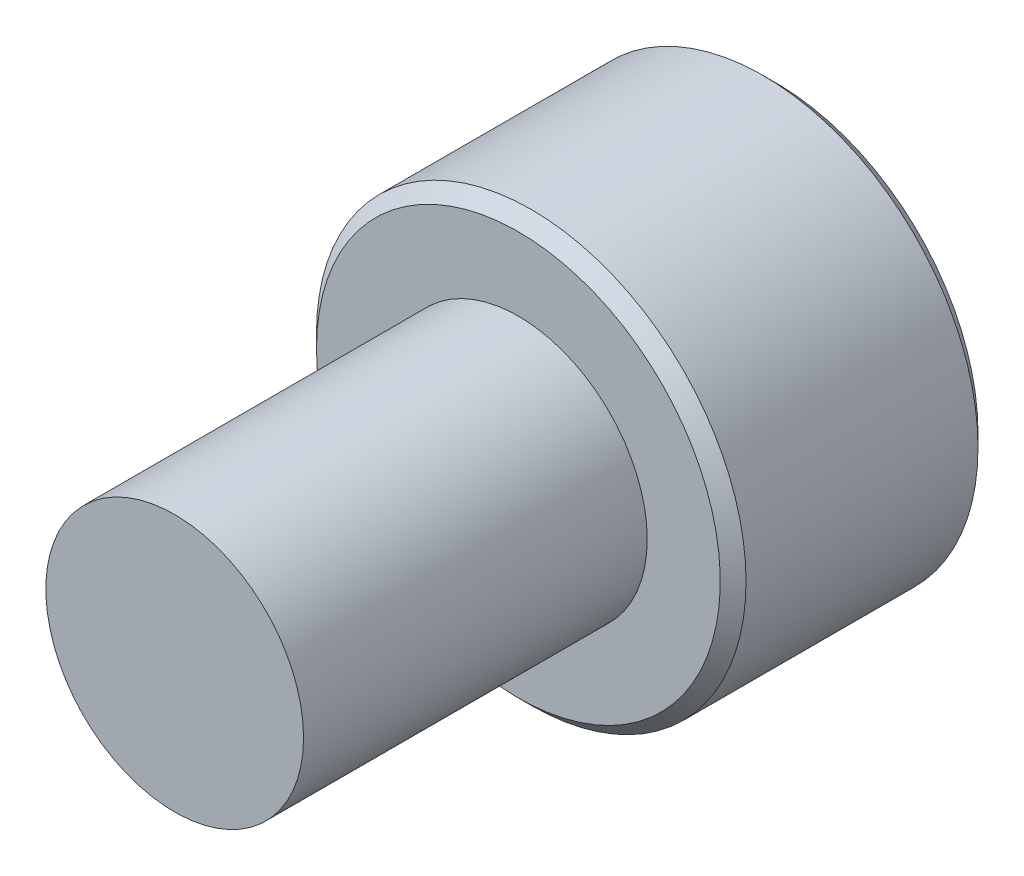
ISO-10303-21;
HEADER;
FILE_DESCRIPTION(('STEP AP214'),'2;1');
FILE_NAME('part.step','',(''),(''),'','','');
FILE_SCHEMA(('AUTOMOTIVE_DESIGN { 1 0 10303 214 1 1 1 1 }'));
ENDSEC;
DATA;
#1=APPLICATION_CONTEXT('core data for automotive mechanical design processes');
#2=APPLICATION_PROTOCOL_DEFINITION('international standard','automotive_design',2000,#1);
#3=PRODUCT_CONTEXT('',#1,'mechanical');
#4=PRODUCT('Part','Part','',(#3));
#5=PRODUCT_RELATED_PRODUCT_CATEGORY('part','',(#4));
#6=PRODUCT_DEFINITION_FORMATION('','',#4);
#7=PRODUCT_DEFINITION_CONTEXT('part definition',#1,'design');
#8=PRODUCT_DEFINITION('design','',#6,#7);
#9=PRODUCT_DEFINITION_SHAPE('','',#8);
#10=(LENGTH_UNIT() NAMED_UNIT(*) SI_UNIT(.MILLI.,.METRE.));
#11=(NAMED_UNIT(*) PLANE_ANGLE_UNIT() SI_UNIT($,.RADIAN.));
#12=(NAMED_UNIT(*) SI_UNIT($,.STERADIAN.) SOLID_ANGLE_UNIT());
#13=UNCERTAINTY_MEASURE_WITH_UNIT(LENGTH_MEASURE(1.E-05),#10,'distance_accuracy_value','');
#14=(GEOMETRIC_REPRESENTATION_CONTEXT(3) GLOBAL_UNCERTAINTY_ASSIGNED_CONTEXT((#13)) GLOBAL_UNIT_ASSIGNED_CONTEXT((#10,
#11,#12)) REPRESENTATION_CONTEXT('',''));
#15=CARTESIAN_POINT('',(0.,0.,0.));
#16=DIRECTION('',(0.,0.,1.));
#17=DIRECTION('',(1.,0.,0.));
#18=AXIS2_PLACEMENT_3D('',#15,#16,#17);
#19=CARTESIAN_POINT('',(0.,0.,-8.));
#20=DIRECTION('',(0.,0.,1.));
#21=DIRECTION('',(1.,0.,0.));
#22=AXIS2_PLACEMENT_3D('',#19,#20,#21);
#23=CYLINDRICAL_SURFACE('',#22,3.);
#24=CARTESIAN_POINT('',(0.,0.,0.));
#25=DIRECTION('',(0.,0.,1.));
#26=DIRECTION('',(1.,0.,0.));
#27=AXIS2_PLACEMENT_3D('',#24,#25,#26);
#28=CIRCLE('',#27,3.);
#29=CARTESIAN_POINT('',(3.,0.,0.));
#30=VERTEX_POINT('',#29);
#31=EDGE_CURVE('E110',#30,#30,#28,.T.);
#32=ORIENTED_EDGE('',*,*,#31,.F.);
#33=EDGE_LOOP('',(#32));
#34=FACE_BOUND('',#33,.T.);
#35=CARTESIAN_POINT('',(0.,0.,-8.));
#36=DIRECTION('',(0.,0.,-1.));
#37=DIRECTION('',(-1.,0.,0.));
#38=AXIS2_PLACEMENT_3D('',#35,#36,#37);
#39=CIRCLE('',#38,3.);
#40=CARTESIAN_POINT('',(-3.,0.,-8.));
#41=VERTEX_POINT('',#40);
#42=EDGE_CURVE('E209',#41,#41,#39,.F.);
#43=ORIENTED_EDGE('',*,*,#42,.T.);
#44=EDGE_LOOP('',(#43));
#45=FACE_BOUND('',#44,.T.);
#46=ADVANCED_FACE('F36',(#34,#45),#23,.T.);
#47=CARTESIAN_POINT('',(0.,0.,0.));
#48=DIRECTION('',(0.,0.,1.));
#49=DIRECTION('',(1.,0.,0.));
#50=AXIS2_PLACEMENT_3D('',#47,#48,#49);
#51=PLANE('',#50);
#52=ORIENTED_EDGE('',*,*,#31,.T.);
#53=EDGE_LOOP('',(#52));
#54=FACE_BOUND('',#53,.T.);
#55=ADVANCED_FACE('F194',(#54),#51,.T.);
#56=CARTESIAN_POINT('',(0.,0.,-14.));
#57=DIRECTION('',(0.,0.,1.));
#58=DIRECTION('',(1.,0.,0.));
#59=AXIS2_PLACEMENT_3D('',#56,#57,#58);
#60=CYLINDRICAL_SURFACE('',#59,5.);
#61=CARTESIAN_POINT('',(0.,0.,-13.7));
#62=DIRECTION('',(0.,0.,-1.));
#63=DIRECTION('',(-1.,0.,0.));
#64=AXIS2_PLACEMENT_3D('',#61,#62,#63);
#65=CIRCLE('',#64,5.);
#66=CARTESIAN_POINT('',(5.,0.,-13.7));
#67=VERTEX_POINT('',#66);
#68=EDGE_CURVE('E44',#67,#67,#65,.F.);
#69=ORIENTED_EDGE('',*,*,#68,.T.);
#70=EDGE_LOOP('',(#69));
#71=FACE_BOUND('',#70,.T.);
#72=CARTESIAN_POINT('',(0.,0.,-8.3));
#73=DIRECTION('',(0.,0.,-1.));
#74=DIRECTION('',(-1.,0.,0.));
#75=AXIS2_PLACEMENT_3D('',#72,#73,#74);
#76=CIRCLE('',#75,5.);
#77=CARTESIAN_POINT('',(-5.,0.,-8.3));
#78=VERTEX_POINT('',#77);
#79=EDGE_CURVE('E173',#78,#78,#76,.T.);
#80=ORIENTED_EDGE('',*,*,#79,.T.);
#81=EDGE_LOOP('',(#80));
#82=FACE_BOUND('',#81,.T.);
#83=ADVANCED_FACE('F178',(#71,#82),#60,.T.);
#84=CARTESIAN_POINT('',(0.,0.,-14.));
#85=DIRECTION('',(0.,0.,-1.));
#86=DIRECTION('',(-1.,0.,0.));
#87=AXIS2_PLACEMENT_3D('',#84,#85,#86);
#88=PLANE('',#87);
#89=CARTESIAN_POINT('',(0.,0.,-14.));
#90=DIRECTION('',(0.,0.,-1.));
#91=DIRECTION('',(-1.,0.,0.));
#92=AXIS2_PLACEMENT_3D('',#89,#90,#91);
#93=CIRCLE('',#92,4.7);
#94=CARTESIAN_POINT('',(4.7,0.,-14.));
#95=VERTEX_POINT('',#94);
#96=EDGE_CURVE('E109',#95,#95,#93,.T.);
#97=ORIENTED_EDGE('',*,*,#96,.T.);
#98=EDGE_LOOP('',(#97));
#99=FACE_BOUND('',#98,.T.);
#100=CARTESIAN_POINT('',(0.,0.,-14.));
#101=DIRECTION('',(0.,0.,-1.));
#102=DIRECTION('',(-1.,0.,0.));
#103=AXIS2_PLACEMENT_3D('',#100,#101,#102);
#104=CIRCLE('',#103,2.88675134594813);
#105=CARTESIAN_POINT('',(-2.5,1.44337567297407,-14.));
#106=VERTEX_POINT('',#105);
#107=CARTESIAN_POINT('',(0.,2.88675134594813,-14.));
#108=VERTEX_POINT('',#107);
#109=EDGE_CURVE('E90',#106,#108,#104,.T.);
#110=ORIENTED_EDGE('',*,*,#109,.F.);
#111=CARTESIAN_POINT('',(-2.5,-1.44337567297406,-14.));
#112=VERTEX_POINT('',#111);
#113=EDGE_CURVE('E50',#112,#106,#104,.T.);
#114=ORIENTED_EDGE('',*,*,#113,.F.);
#115=CARTESIAN_POINT('',(0.,-2.88675134594813,-14.));
#116=VERTEX_POINT('',#115);
#117=EDGE_CURVE('E267',#116,#112,#104,.T.);
#118=ORIENTED_EDGE('',*,*,#117,.F.);
#119=CARTESIAN_POINT('',(2.5,-1.44337567297406,-14.));
#120=VERTEX_POINT('',#119);
#121=EDGE_CURVE('E57',#120,#116,#104,.T.);
#122=ORIENTED_EDGE('',*,*,#121,.F.);
#123=CARTESIAN_POINT('',(2.5,1.44337567297407,-14.));
#124=VERTEX_POINT('',#123);
#125=EDGE_CURVE('E131',#124,#120,#104,.T.);
#126=ORIENTED_EDGE('',*,*,#125,.F.);
#127=EDGE_CURVE('E99',#108,#124,#104,.T.);
#128=ORIENTED_EDGE('',*,*,#127,.F.);
#129=EDGE_LOOP('',(#110,#114,#118,#122,#126,#128));
#130=FACE_BOUND('',#129,.T.);
#131=ADVANCED_FACE('F130',(#99,#130),#88,.T.);
#132=CARTESIAN_POINT('',(0.,0.,-8.));
#133=DIRECTION('',(0.,0.,-1.));
#134=DIRECTION('',(-1.,0.,0.));
#135=AXIS2_PLACEMENT_3D('',#132,#133,#134);
#136=PLANE('',#135);
#137=CARTESIAN_POINT('',(0.,0.,-8.));
#138=DIRECTION('',(0.,0.,-1.));
#139=DIRECTION('',(-1.,0.,0.));
#140=AXIS2_PLACEMENT_3D('',#137,#138,#139);
#141=CIRCLE('',#140,4.7);
#142=CARTESIAN_POINT('',(-4.7,0.,-8.));
#143=VERTEX_POINT('',#142);
#144=EDGE_CURVE('E11',#143,#143,#141,.F.);
#145=ORIENTED_EDGE('',*,*,#144,.T.);
#146=EDGE_LOOP('',(#145));
#147=FACE_BOUND('',#146,.T.);
#148=ORIENTED_EDGE('',*,*,#42,.F.);
#149=EDGE_LOOP('',(#148));
#150=FACE_BOUND('',#149,.T.);
#151=ADVANCED_FACE('F187',(#147,#150),#136,.F.);
#152=CARTESIAN_POINT('',(0.,0.,-14.));
#153=DIRECTION('',(0.,0.,-1.));
#154=DIRECTION('',(-1.,0.,0.));
#155=AXIS2_PLACEMENT_3D('',#152,#153,#154);
#156=CONICAL_SURFACE('',#155,2.88675134594813,0.78539816339745);
#157=ORIENTED_EDGE('',*,*,#127,.T.);
#158=CARTESIAN_POINT('',(-0.000199999999999645,2.88686681600197,-14.0001154769818));
#159=CARTESIAN_POINT('',(0.0857382777877653,2.83725032818751,-13.9505407053547));
#160=CARTESIAN_POINT('',(0.173113567275754,2.7868041812811,-13.9038774813625));
#161=CARTESIAN_POINT('',(0.351281456165589,2.6839389026696,-13.8184381400383));
#162=CARTESIAN_POINT('',(0.442091000681075,2.6315099876986,-13.779709562406));
#163=CARTESIAN_POINT('',(0.625204123126922,2.52578957716234,-13.7133667038977));
#164=CARTESIAN_POINT('',(0.717461064529341,2.47252500720904,-13.6855856685309));
#165=CARTESIAN_POINT('',(0.904006008776287,2.3648232334321,-13.6427831759107));
#166=CARTESIAN_POINT('',(0.998288312566284,2.31038931995913,-13.6277297666713));
#167=CARTESIAN_POINT('',(1.16077825829185,2.21657570605387,-13.6141477222095));
#168=CARTESIAN_POINT('',(1.22877596788015,2.17731721011878,-13.6121370992408));
#169=CARTESIAN_POINT('',(1.36466024116922,2.0988643883567,-13.6155241171875));
#170=CARTESIAN_POINT('',(1.43254675755224,2.05967008984862,-13.6209243552998));
#171=CARTESIAN_POINT('',(1.56767878823611,1.98165157555715,-13.6388257884025));
#172=CARTESIAN_POINT('',(1.63492349975356,1.94282782326097,-13.6513349270465));
#173=CARTESIAN_POINT('',(1.7682501008182,1.86585167424616,-13.6827675019557));
#174=CARTESIAN_POINT('',(1.83433207909966,1.82769922629678,-13.7016904464968));
#175=CARTESIAN_POINT('',(2.00359634669127,1.72997445583858,-13.7578673614082));
#176=CARTESIAN_POINT('',(2.10572912222289,1.67100807039231,-13.7993558315962));
#177=CARTESIAN_POINT('',(2.25590641494051,1.58430317001562,-13.8693940467231));
#178=CARTESIAN_POINT('',(2.30539653988261,1.55573003305807,-13.8940022521161));
#179=CARTESIAN_POINT('',(2.40346006383885,1.49911303110426,-13.9454618867152));
#180=CARTESIAN_POINT('',(2.45203400349693,1.47106885396706,-13.9723119387794));
#181=CARTESIAN_POINT('',(2.5002,1.44326020292023,-14.0001154769818));
#182=B_SPLINE_CURVE_WITH_KNOTS('',3,(#158,#159,#160,#161,#162,#163,#164,#165,#166,#167,#168,
#169,#170,#171,#172,#173,#174,#175,#176,#177,#178,#179,#180,#181),.UNSPECIFIED.,.F.,.F.,(4,2,2,
2,2,2,2,2,2,2,2,4),(0.,0.333012085133924,0.667964518301397,0.997597032043299,1.32639954393844,
1.56169424147169,1.79707142102083,2.03271213522171,2.26833478775651,2.64260240809533,
2.82922877818864,3.01574133749025),.UNSPECIFIED.);
#183=EDGE_CURVE('E104',#108,#124,#182,.T.);
#184=ORIENTED_EDGE('',*,*,#183,.F.);
#185=EDGE_LOOP('',(#157,#184));
#186=FACE_BOUND('',#185,.T.);
#187=ADVANCED_FACE('F105',(#186),#156,.F.);
#188=ORIENTED_EDGE('',*,*,#125,.T.);
#189=CARTESIAN_POINT('',(2.5,-2.87868021616154,-14.9259641937847));
#190=CARTESIAN_POINT('',(2.5,-2.80858751756355,-14.8730547693995));
#191=CARTESIAN_POINT('',(2.5,-2.73810237384458,-14.8206567848064));
#192=CARTESIAN_POINT('',(2.5,-2.59619238907469,-14.7171126835152));
#193=CARTESIAN_POINT('',(2.5,-2.52476731657143,-14.6659668843779));
#194=CARTESIAN_POINT('',(2.5,-2.38030019419698,-14.5647924979814));
#195=CARTESIAN_POINT('',(2.5,-2.307249903594,-14.5147756377845));
#196=CARTESIAN_POINT('',(2.5,-2.15990937397294,-14.4166088439155));
#197=CARTESIAN_POINT('',(2.5,-2.08561922308943,-14.3684587783455));
#198=CARTESIAN_POINT('',(2.5,-1.93130274871409,-14.271746559452));
#199=CARTESIAN_POINT('',(2.5,-1.8511916849785,-14.2233189325373));
#200=CARTESIAN_POINT('',(2.5,-1.68912282627168,-14.1296640597041));
#201=CARTESIAN_POINT('',(2.5,-1.60716527674864,-14.0844363916948));
#202=CARTESIAN_POINT('',(2.5,-1.44137668632319,-13.9981353746693));
#203=CARTESIAN_POINT('',(2.5,-1.35755175925796,-13.9570503726636));
#204=CARTESIAN_POINT('',(2.5,-1.1876157775942,-13.8799618661066));
#205=CARTESIAN_POINT('',(2.5,-1.10150577924729,-13.8439560607346));
#206=CARTESIAN_POINT('',(2.5,-0.933895283730374,-13.7809497442851));
#207=CARTESIAN_POINT('',(2.5,-0.852581486652412,-13.7534577201431));
#208=CARTESIAN_POINT('',(2.5,-0.687996185051425,-13.7049971144174));
#209=CARTESIAN_POINT('',(2.5,-0.604724546085162,-13.684028982239));
#210=CARTESIAN_POINT('',(2.5,-0.438105786501649,-13.650059995013));
#211=CARTESIAN_POINT('',(2.5,-0.35478695737788,-13.6369226334436));
#212=CARTESIAN_POINT('',(2.5,-0.187258638268771,-13.6188701943996));
#213=CARTESIAN_POINT('',(2.5,-0.103049303891731,-13.6139537035302));
#214=CARTESIAN_POINT('',(2.5,0.0623819458555507,-13.6127080743719));
#215=CARTESIAN_POINT('',(2.5,0.143601667742495,-13.6160745517109));
#216=CARTESIAN_POINT('',(2.5,0.305344840533965,-13.6305375923809));
#217=CARTESIAN_POINT('',(2.5,0.385868223029659,-13.6416349066531));
#218=CARTESIAN_POINT('',(2.5,0.546999992477731,-13.6711420785853));
#219=CARTESIAN_POINT('',(2.5,0.62758525815638,-13.6896763768309));
#220=CARTESIAN_POINT('',(2.5,0.786991930978588,-13.7330723320141));
#221=CARTESIAN_POINT('',(2.5,0.865813485110825,-13.7579334595174));
#222=CARTESIAN_POINT('',(2.5,1.11399280220491,-13.8455589112399));
#223=CARTESIAN_POINT('',(2.5,1.27984027529456,-13.9183033354746));
#224=CARTESIAN_POINT('',(2.5,1.52253018655039,-14.0395423452678));
#225=CARTESIAN_POINT('',(2.5,1.60256472908879,-14.0820714512072));
#226=CARTESIAN_POINT('',(2.5,1.76081489282125,-14.1703965241522));
#227=CARTESIAN_POINT('',(2.5,1.83903083842887,-14.2161919024767));
#228=CARTESIAN_POINT('',(2.5,1.99000684607168,-14.3080446787287));
#229=CARTESIAN_POINT('',(2.5,2.06284472030444,-14.3539756354245));
#230=CARTESIAN_POINT('',(2.5,2.20727164736135,-14.4477702453865));
#231=CARTESIAN_POINT('',(2.5,2.27886060500402,-14.4956340450436));
#232=CARTESIAN_POINT('',(2.5,2.42037078548403,-14.5925522363183));
#233=CARTESIAN_POINT('',(2.5,2.49030083172878,-14.6415937983162));
#234=CARTESIAN_POINT('',(2.5,2.62920524991558,-14.7409738351898));
#235=CARTESIAN_POINT('',(2.5,2.69817987937839,-14.7913119497074));
#236=CARTESIAN_POINT('',(2.5,2.76675463365823,-14.8421802976824));
#237=B_SPLINE_CURVE_WITH_KNOTS('',3,(#189,#190,#191,#192,#193,#194,#195,#196,#197,#198,#199,
#200,#201,#202,#203,#204,#205,#206,#207,#208,#209,#210,#211,#212,#213,#214,#215,#216,#217,#218,
#219,#220,#221,#222,#223,#224,#225,#226,#227,#228,#229,#230,#231,#232,#233,#234,#235,#236),
.UNSPECIFIED.,.F.,.F.,(4,2,2,2,2,2,2,2,2,2,2,2,2,2,2,2,2,2,2,2,2,2,2,4),(0.,0.263465914971113,
0.526997968323236,0.79257194327936,1.05812711983771,1.33890112548018,1.61963802629079,
1.89956181222216,2.17935838571897,2.436638876826,2.69393708705248,2.94660788173135,
3.19923523085016,3.44271854486786,3.68622551313359,3.93398926860573,4.18173229781968,
4.72334004841908,4.99521600382014,5.26704308216966,5.52534341671993,5.78366335141086,
6.03988492204047,6.29603603207541),.UNSPECIFIED.);
#238=EDGE_CURVE('E98',#124,#120,#237,.F.);
#239=ORIENTED_EDGE('',*,*,#238,.F.);
#240=EDGE_LOOP('',(#188,#239));
#241=FACE_BOUND('',#240,.T.);
#242=ADVANCED_FACE('F273',(#241),#156,.F.);
#243=ORIENTED_EDGE('',*,*,#121,.T.);
#244=CARTESIAN_POINT('',(2.5002,-1.44326020292023,-14.0001154769818));
#245=CARTESIAN_POINT('',(2.41426172221224,-1.49287669073469,-13.9505407053547));
#246=CARTESIAN_POINT('',(2.32688643272425,-1.5433228376411,-13.9038774813625));
#247=CARTESIAN_POINT('',(2.14871854383441,-1.64618811625259,-13.8184381400383));
#248=CARTESIAN_POINT('',(2.05790899931893,-1.69861703122359,-13.779709562406));
#249=CARTESIAN_POINT('',(1.87479587687308,-1.80433744175986,-13.7133667038977));
#250=CARTESIAN_POINT('',(1.78253893547066,-1.85760201171315,-13.6855856685309));
#251=CARTESIAN_POINT('',(1.59599399122371,-1.96530378549009,-13.6427831759107));
#252=CARTESIAN_POINT('',(1.50171168743372,-2.01973769896307,-13.6277297666713));
#253=CARTESIAN_POINT('',(1.33922174170816,-2.11355131286833,-13.6141477222095));
#254=CARTESIAN_POINT('',(1.27122403211985,-2.15280980880341,-13.6121370992408));
#255=CARTESIAN_POINT('',(1.13533975883078,-2.23126263056549,-13.6155241171875));
#256=CARTESIAN_POINT('',(1.06745324244776,-2.27045692907358,-13.6209243552998));
#257=CARTESIAN_POINT('',(0.932321211763895,-2.34847544336505,-13.6388257884025));
#258=CARTESIAN_POINT('',(0.86507650024644,-2.38729919566123,-13.6513349270465));
#259=CARTESIAN_POINT('',(0.731749899181801,-2.46427534467604,-13.6827675019557));
#260=CARTESIAN_POINT('',(0.665667920900343,-2.50242779262542,-13.7016904464968));
#261=CARTESIAN_POINT('',(0.496403653308736,-2.60015256308362,-13.7578673614082));
#262=CARTESIAN_POINT('',(0.394270877777108,-2.65911894852989,-13.7993558315962));
#263=CARTESIAN_POINT('',(0.244093585059492,-2.74582384890657,-13.8693940467231));
#264=CARTESIAN_POINT('',(0.194603460117392,-2.77439698586412,-13.8940022521161));
#265=CARTESIAN_POINT('',(0.0965399361611544,-2.83101398781794,-13.9454618867152));
#266=CARTESIAN_POINT('',(0.0479659965030732,-2.85905816495513,-13.9723119387794));
#267=CARTESIAN_POINT('',(-0.000199999999998921,-2.88686681600197,-14.0001154769818));
#268=B_SPLINE_CURVE_WITH_KNOTS('',3,(#244,#245,#246,#247,#248,#249,#250,#251,#252,#253,#254,
#255,#256,#257,#258,#259,#260,#261,#262,#263,#264,#265,#266,#267),.UNSPECIFIED.,.F.,.F.,(4,2,2,
2,2,2,2,2,2,2,2,4),(0.,0.333012085133924,0.667964518301398,0.9975970320433,1.32639954393844,
1.56169424147169,1.79707142102083,2.03271213522171,2.26833478775651,2.64260240809533,
2.82922877818864,3.01574133749025),.UNSPECIFIED.);
#269=EDGE_CURVE('E141',#120,#116,#268,.T.);
#270=ORIENTED_EDGE('',*,*,#269,.F.);
#271=EDGE_LOOP('',(#243,#270));
#272=FACE_BOUND('',#271,.T.);
#273=ADVANCED_FACE('F270',(#272),#156,.F.);
#274=ORIENTED_EDGE('',*,*,#117,.T.);
#275=CARTESIAN_POINT('',(0.000200000000001078,-2.88686681600197,-14.0001154769818));
#276=CARTESIAN_POINT('',(-0.0857382777877636,-2.83725032818751,-13.9505407053547));
#277=CARTESIAN_POINT('',(-0.173113567275752,-2.7868041812811,-13.9038774813625));
#278=CARTESIAN_POINT('',(-0.351281456165588,-2.6839389026696,-13.8184381400383));
#279=CARTESIAN_POINT('',(-0.442091000681074,-2.6315099876986,-13.779709562406));
#280=CARTESIAN_POINT('',(-0.62520412312692,-2.52578957716234,-13.7133667038977));
#281=CARTESIAN_POINT('',(-0.71746106452934,-2.47252500720904,-13.6855856685309));
#282=CARTESIAN_POINT('',(-0.904006008776285,-2.3648232334321,-13.6427831759107));
#283=CARTESIAN_POINT('',(-0.998288312566282,-2.31038931995913,-13.6277297666713));
#284=CARTESIAN_POINT('',(-1.16077825829184,-2.21657570605387,-13.6141477222095));
#285=CARTESIAN_POINT('',(-1.22877596788015,-2.17731721011878,-13.6121370992408));
#286=CARTESIAN_POINT('',(-1.36466024116922,-2.0988643883567,-13.6155241171875));
#287=CARTESIAN_POINT('',(-1.43254675755224,-2.05967008984862,-13.6209243552998));
#288=CARTESIAN_POINT('',(-1.5676787882361,-1.98165157555715,-13.6388257884025));
#289=CARTESIAN_POINT('',(-1.63492349975356,-1.94282782326097,-13.6513349270465));
#290=CARTESIAN_POINT('',(-1.7682501008182,-1.86585167424616,-13.6827675019557));
#291=CARTESIAN_POINT('',(-1.83433207909966,-1.82769922629678,-13.7016904464968));
#292=CARTESIAN_POINT('',(-2.00359634669126,-1.72997445583858,-13.7578673614082));
#293=CARTESIAN_POINT('',(-2.10572912222289,-1.67100807039231,-13.7993558315962));
#294=CARTESIAN_POINT('',(-2.25590641494051,-1.58430317001562,-13.8693940467231));
#295=CARTESIAN_POINT('',(-2.30539653988261,-1.55573003305807,-13.8940022521161));
#296=CARTESIAN_POINT('',(-2.40346006383885,-1.49911303110426,-13.9454618867152));
#297=CARTESIAN_POINT('',(-2.45203400349693,-1.47106885396706,-13.9723119387794));
#298=CARTESIAN_POINT('',(-2.5002,-1.44326020292023,-14.0001154769818));
#299=B_SPLINE_CURVE_WITH_KNOTS('',3,(#275,#276,#277,#278,#279,#280,#281,#282,#283,#284,#285,
#286,#287,#288,#289,#290,#291,#292,#293,#294,#295,#296,#297,#298),.UNSPECIFIED.,.F.,.F.,(4,2,2,
2,2,2,2,2,2,2,2,4),(0.,0.333012085133925,0.667964518301397,0.997597032043299,1.32639954393844,
1.56169424147169,1.79707142102083,2.03271213522171,2.26833478775651,2.64260240809533,
2.82922877818864,3.01574133749025),.UNSPECIFIED.);
#300=EDGE_CURVE('E244',#116,#112,#299,.T.);
#301=ORIENTED_EDGE('',*,*,#300,.F.);
#302=EDGE_LOOP('',(#274,#301));
#303=FACE_BOUND('',#302,.T.);
#304=ADVANCED_FACE('F269',(#303),#156,.F.);
#305=ORIENTED_EDGE('',*,*,#113,.T.);
#306=CARTESIAN_POINT('',(-2.5,-2.87868021616154,-14.9259641937847));
#307=CARTESIAN_POINT('',(-2.5,-2.80858751756355,-14.8730547693995));
#308=CARTESIAN_POINT('',(-2.5,-2.73810237384458,-14.8206567848064));
#309=CARTESIAN_POINT('',(-2.5,-2.59619238907469,-14.7171126835152));
#310=CARTESIAN_POINT('',(-2.5,-2.52476731657143,-14.6659668843779));
#311=CARTESIAN_POINT('',(-2.5,-2.38030019419698,-14.5647924979814));
#312=CARTESIAN_POINT('',(-2.5,-2.307249903594,-14.5147756377845));
#313=CARTESIAN_POINT('',(-2.5,-2.15990937397294,-14.4166088439155));
#314=CARTESIAN_POINT('',(-2.5,-2.08561922308943,-14.3684587783455));
#315=CARTESIAN_POINT('',(-2.5,-1.93130274871409,-14.271746559452));
#316=CARTESIAN_POINT('',(-2.5,-1.8511916849785,-14.2233189325373));
#317=CARTESIAN_POINT('',(-2.5,-1.68912282627168,-14.1296640597041));
#318=CARTESIAN_POINT('',(-2.5,-1.60716527674864,-14.0844363916948));
#319=CARTESIAN_POINT('',(-2.5,-1.44137668632319,-13.9981353746693));
#320=CARTESIAN_POINT('',(-2.5,-1.35755175925796,-13.9570503726636));
#321=CARTESIAN_POINT('',(-2.5,-1.1876157775942,-13.8799618661066));
#322=CARTESIAN_POINT('',(-2.5,-1.10150577924729,-13.8439560607346));
#323=CARTESIAN_POINT('',(-2.5,-0.933895283730374,-13.7809497442851));
#324=CARTESIAN_POINT('',(-2.5,-0.852581486652412,-13.7534577201431));
#325=CARTESIAN_POINT('',(-2.5,-0.687996185051426,-13.7049971144174));
#326=CARTESIAN_POINT('',(-2.5,-0.604724546085163,-13.684028982239));
#327=CARTESIAN_POINT('',(-2.5,-0.438105786501649,-13.650059995013));
#328=CARTESIAN_POINT('',(-2.5,-0.354786957377882,-13.6369226334436));
#329=CARTESIAN_POINT('',(-2.5,-0.187258638268773,-13.6188701943996));
#330=CARTESIAN_POINT('',(-2.5,-0.103049303891733,-13.6139537035302));
#331=CARTESIAN_POINT('',(-2.5,0.0623819458555486,-13.6127080743719));
#332=CARTESIAN_POINT('',(-2.5,0.143601667742494,-13.6160745517109));
#333=CARTESIAN_POINT('',(-2.5,0.305344840533964,-13.6305375923809));
#334=CARTESIAN_POINT('',(-2.5,0.385868223029657,-13.6416349066531));
#335=CARTESIAN_POINT('',(-2.5,0.54699999247773,-13.6711420785853));
#336=CARTESIAN_POINT('',(-2.5,0.627585258156379,-13.6896763768309));
#337=CARTESIAN_POINT('',(-2.5,0.786991930978586,-13.7330723320141));
#338=CARTESIAN_POINT('',(-2.5,0.865813485110824,-13.7579334595174));
#339=CARTESIAN_POINT('',(-2.5,1.11399280220491,-13.8455589112399));
#340=CARTESIAN_POINT('',(-2.5,1.27984027529456,-13.9183033354746));
#341=CARTESIAN_POINT('',(-2.5,1.52253018655038,-14.0395423452678));
#342=CARTESIAN_POINT('',(-2.5,1.60256472908879,-14.0820714512072));
#343=CARTESIAN_POINT('',(-2.5,1.76081489282124,-14.1703965241522));
#344=CARTESIAN_POINT('',(-2.5,1.83903083842886,-14.2161919024767));
#345=CARTESIAN_POINT('',(-2.5,1.99000684607167,-14.3080446787286));
#346=CARTESIAN_POINT('',(-2.5,2.06284472030444,-14.3539756354245));
#347=CARTESIAN_POINT('',(-2.5,2.20727164736135,-14.4477702453865));
#348=CARTESIAN_POINT('',(-2.5,2.27886060500402,-14.4956340450436));
#349=CARTESIAN_POINT('',(-2.5,2.42037078548403,-14.5925522363183));
#350=CARTESIAN_POINT('',(-2.5,2.49030083172878,-14.6415937983162));
#351=CARTESIAN_POINT('',(-2.5,2.62920524991558,-14.7409738351898));
#352=CARTESIAN_POINT('',(-2.5,2.69817987937839,-14.7913119497074));
#353=CARTESIAN_POINT('',(-2.5,2.76675463365823,-14.8421802976824));
#354=B_SPLINE_CURVE_WITH_KNOTS('',3,(#306,#307,#308,#309,#310,#311,#312,#313,#314,#315,#316,
#317,#318,#319,#320,#321,#322,#323,#324,#325,#326,#327,#328,#329,#330,#331,#332,#333,#334,#335,
#336,#337,#338,#339,#340,#341,#342,#343,#344,#345,#346,#347,#348,#349,#350,#351,#352,#353),
.UNSPECIFIED.,.F.,.F.,(4,2,2,2,2,2,2,2,2,2,2,2,2,2,2,2,2,2,2,2,2,2,2,4),(0.,0.263465914971115,
0.526997968323237,0.792571943279361,1.05812711983771,1.33890112548018,1.61963802629079,
1.89956181222216,2.17935838571897,2.436638876826,2.69393708705248,2.94660788173135,
3.19923523085016,3.44271854486786,3.68622551313359,3.93398926860573,4.18173229781968,
4.72334004841908,4.99521600382014,5.26704308216966,5.52534341671993,5.78366335141086,
6.03988492204047,6.29603603207541),.UNSPECIFIED.);
#355=EDGE_CURVE('E120',#112,#106,#354,.T.);
#356=ORIENTED_EDGE('',*,*,#355,.F.);
#357=EDGE_LOOP('',(#305,#356));
#358=FACE_BOUND('',#357,.T.);
#359=ADVANCED_FACE('F282',(#358),#156,.F.);
#360=ORIENTED_EDGE('',*,*,#109,.T.);
#361=CARTESIAN_POINT('',(-2.5002,1.44326020292023,-14.0001154769818));
#362=CARTESIAN_POINT('',(-2.41426172221224,1.49287669073469,-13.9505407053547));
#363=CARTESIAN_POINT('',(-2.32688643272425,1.5433228376411,-13.9038774813625));
#364=CARTESIAN_POINT('',(-2.14871854383441,1.64618811625259,-13.8184381400383));
#365=CARTESIAN_POINT('',(-2.05790899931893,1.69861703122359,-13.779709562406));
#366=CARTESIAN_POINT('',(-1.87479587687308,1.80433744175986,-13.7133667038977));
#367=CARTESIAN_POINT('',(-1.78253893547066,1.85760201171315,-13.6855856685309));
#368=CARTESIAN_POINT('',(-1.59599399122372,1.96530378549009,-13.6427831759107));
#369=CARTESIAN_POINT('',(-1.50171168743372,2.01973769896307,-13.6277297666713));
#370=CARTESIAN_POINT('',(-1.33922174170816,2.11355131286833,-13.6141477222095));
#371=CARTESIAN_POINT('',(-1.27122403211985,2.15280980880341,-13.6121370992408));
#372=CARTESIAN_POINT('',(-1.13533975883078,2.23126263056549,-13.6155241171875));
#373=CARTESIAN_POINT('',(-1.06745324244776,2.27045692907357,-13.6209243552998));
#374=CARTESIAN_POINT('',(-0.932321211763896,2.34847544336505,-13.6388257884025));
#375=CARTESIAN_POINT('',(-0.865076500246441,2.38729919566123,-13.6513349270465));
#376=CARTESIAN_POINT('',(-0.731749899181802,2.46427534467603,-13.6827675019557));
#377=CARTESIAN_POINT('',(-0.665667920900344,2.50242779262542,-13.7016904464968));
#378=CARTESIAN_POINT('',(-0.496403653308737,2.60015256308362,-13.7578673614082));
#379=CARTESIAN_POINT('',(-0.394270877777109,2.65911894852989,-13.7993558315962));
#380=CARTESIAN_POINT('',(-0.244093585059492,2.74582384890657,-13.8693940467231));
#381=CARTESIAN_POINT('',(-0.194603460117392,2.77439698586412,-13.8940022521161));
#382=CARTESIAN_POINT('',(-0.096539936161154,2.83101398781794,-13.9454618867152));
#383=CARTESIAN_POINT('',(-0.0479659965030727,2.85905816495513,-13.9723119387794));
#384=CARTESIAN_POINT('',(0.000199999999999519,2.88686681600197,-14.0001154769818));
#385=B_SPLINE_CURVE_WITH_KNOTS('',3,(#361,#362,#363,#364,#365,#366,#367,#368,#369,#370,#371,
#372,#373,#374,#375,#376,#377,#378,#379,#380,#381,#382,#383,#384),.UNSPECIFIED.,.F.,.F.,(4,2,2,
2,2,2,2,2,2,2,2,4),(0.,0.333012085133923,0.667964518301396,0.997597032043298,1.32639954393844,
1.56169424147168,1.79707142102083,2.03271213522171,2.2683347877565,2.64260240809533,
2.82922877818864,3.01574133749025),.UNSPECIFIED.);
#386=EDGE_CURVE('E94',#106,#108,#385,.T.);
#387=ORIENTED_EDGE('',*,*,#386,.F.);
#388=EDGE_LOOP('',(#360,#387));
#389=FACE_BOUND('',#388,.T.);
#390=ADVANCED_FACE('F92',(#389),#156,.F.);
#391=CARTESIAN_POINT('',(2.5,4.33012701892219,-10.25));
#392=DIRECTION('',(0.,0.,-1.));
#393=DIRECTION('',(-1.,0.,0.));
#394=AXIS2_PLACEMENT_3D('',#391,#392,#393);
#395=PLANE('',#394);
#396=DIRECTION('',(0.866025403784439,0.5,0.));
#397=VECTOR('',#396,1.);
#398=CARTESIAN_POINT('',(-2.5,1.44337567297407,-10.25));
#399=LINE('',#398,#397);
#400=CARTESIAN_POINT('',(-2.5,1.44337567297407,-10.25));
#401=VERTEX_POINT('',#400);
#402=CARTESIAN_POINT('',(0.,2.88675134594813,-10.25));
#403=VERTEX_POINT('',#402);
#404=EDGE_CURVE('E119',#401,#403,#399,.T.);
#405=ORIENTED_EDGE('',*,*,#404,.T.);
#406=DIRECTION('',(0.866025403784439,-0.5,0.));
#407=VECTOR('',#406,1.);
#408=CARTESIAN_POINT('',(0.,2.88675134594813,-10.25));
#409=LINE('',#408,#407);
#410=CARTESIAN_POINT('',(2.5,1.44337567297406,-10.25));
#411=VERTEX_POINT('',#410);
#412=EDGE_CURVE('E124',#403,#411,#409,.T.);
#413=ORIENTED_EDGE('',*,*,#412,.T.);
#414=DIRECTION('',(0.,-1.,0.));
#415=VECTOR('',#414,1.);
#416=CARTESIAN_POINT('',(2.5,1.44337567297406,-10.25));
#417=LINE('',#416,#415);
#418=CARTESIAN_POINT('',(2.5,-1.44337567297406,-10.25));
#419=VERTEX_POINT('',#418);
#420=EDGE_CURVE('E230',#411,#419,#417,.T.);
#421=ORIENTED_EDGE('',*,*,#420,.T.);
#422=DIRECTION('',(-0.866025403784439,-0.5,0.));
#423=VECTOR('',#422,1.);
#424=CARTESIAN_POINT('',(2.5,-1.44337567297406,-10.25));
#425=LINE('',#424,#423);
#426=CARTESIAN_POINT('',(0.,-2.88675134594813,-10.25));
#427=VERTEX_POINT('',#426);
#428=EDGE_CURVE('E227',#419,#427,#425,.T.);
#429=ORIENTED_EDGE('',*,*,#428,.T.);
#430=DIRECTION('',(-0.866025403784439,0.5,0.));
#431=VECTOR('',#430,1.);
#432=CARTESIAN_POINT('',(0.,-2.88675134594813,-10.25));
#433=LINE('',#432,#431);
#434=CARTESIAN_POINT('',(-2.5,-1.44337567297406,-10.25));
#435=VERTEX_POINT('',#434);
#436=EDGE_CURVE('E224',#427,#435,#433,.T.);
#437=ORIENTED_EDGE('',*,*,#436,.T.);
#438=DIRECTION('',(0.,1.,0.));
#439=VECTOR('',#438,1.);
#440=CARTESIAN_POINT('',(-2.5,-1.44337567297406,-10.25));
#441=LINE('',#440,#439);
#442=EDGE_CURVE('E127',#435,#401,#441,.T.);
#443=ORIENTED_EDGE('',*,*,#442,.T.);
#444=EDGE_LOOP('',(#405,#413,#421,#429,#437,#443));
#445=FACE_BOUND('',#444,.T.);
#446=ADVANCED_FACE('F161',(#445),#395,.T.);
#447=CARTESIAN_POINT('',(0.,2.88675134594813,-10.25));
#448=DIRECTION('',(0.5,0.866025403784439,0.));
#449=DIRECTION('',(-0.866025403784439,0.5,0.));
#450=AXIS2_PLACEMENT_3D('',#447,#448,#449);
#451=PLANE('',#450);
#452=DIRECTION('',(0.,0.,-1.));
#453=VECTOR('',#452,1.);
#454=CARTESIAN_POINT('',(0.,2.88675134594813,-10.25));
#455=LINE('',#454,#453);
#456=EDGE_CURVE('E116',#403,#108,#455,.T.);
#457=ORIENTED_EDGE('',*,*,#456,.T.);
#458=ORIENTED_EDGE('',*,*,#183,.T.);
#459=DIRECTION('',(0.,0.,-1.));
#460=VECTOR('',#459,1.);
#461=CARTESIAN_POINT('',(2.5,1.44337567297406,-10.25));
#462=LINE('',#461,#460);
#463=EDGE_CURVE('E126',#411,#124,#462,.T.);
#464=ORIENTED_EDGE('',*,*,#463,.F.);
#465=ORIENTED_EDGE('',*,*,#412,.F.);
#466=EDGE_LOOP('',(#457,#458,#464,#465));
#467=FACE_BOUND('',#466,.T.);
#468=ADVANCED_FACE('F122',(#467),#451,.F.);
#469=CARTESIAN_POINT('',(2.5,1.44337567297406,-10.25));
#470=DIRECTION('',(1.,0.,0.));
#471=DIRECTION('',(0.,0.,-1.));
#472=AXIS2_PLACEMENT_3D('',#469,#470,#471);
#473=PLANE('',#472);
#474=ORIENTED_EDGE('',*,*,#463,.T.);
#475=ORIENTED_EDGE('',*,*,#238,.T.);
#476=DIRECTION('',(0.,0.,-1.));
#477=VECTOR('',#476,1.);
#478=CARTESIAN_POINT('',(2.5,-1.44337567297406,-10.25));
#479=LINE('',#478,#477);
#480=EDGE_CURVE('E215',#419,#120,#479,.T.);
#481=ORIENTED_EDGE('',*,*,#480,.F.);
#482=ORIENTED_EDGE('',*,*,#420,.F.);
#483=EDGE_LOOP('',(#474,#475,#481,#482));
#484=FACE_BOUND('',#483,.T.);
#485=ADVANCED_FACE('F150',(#484),#473,.F.);
#486=CARTESIAN_POINT('',(2.5,-1.44337567297406,-10.25));
#487=DIRECTION('',(0.5,-0.866025403784439,0.));
#488=DIRECTION('',(0.866025403784439,0.5,0.));
#489=AXIS2_PLACEMENT_3D('',#486,#487,#488);
#490=PLANE('',#489);
#491=ORIENTED_EDGE('',*,*,#480,.T.);
#492=ORIENTED_EDGE('',*,*,#269,.T.);
#493=DIRECTION('',(0.,0.,-1.));
#494=VECTOR('',#493,1.);
#495=CARTESIAN_POINT('',(0.,-2.88675134594813,-10.25));
#496=LINE('',#495,#494);
#497=EDGE_CURVE('E218',#427,#116,#496,.T.);
#498=ORIENTED_EDGE('',*,*,#497,.F.);
#499=ORIENTED_EDGE('',*,*,#428,.F.);
#500=EDGE_LOOP('',(#491,#492,#498,#499));
#501=FACE_BOUND('',#500,.T.);
#502=ADVANCED_FACE('F154',(#501),#490,.F.);
#503=CARTESIAN_POINT('',(0.,-2.88675134594813,-10.25));
#504=DIRECTION('',(-0.5,-0.866025403784439,0.));
#505=DIRECTION('',(0.866025403784439,-0.5,0.));
#506=AXIS2_PLACEMENT_3D('',#503,#504,#505);
#507=PLANE('',#506);
#508=ORIENTED_EDGE('',*,*,#497,.T.);
#509=ORIENTED_EDGE('',*,*,#300,.T.);
#510=DIRECTION('',(0.,0.,-1.));
#511=VECTOR('',#510,1.);
#512=CARTESIAN_POINT('',(-2.5,-1.44337567297406,-10.25));
#513=LINE('',#512,#511);
#514=EDGE_CURVE('E211',#435,#112,#513,.T.);
#515=ORIENTED_EDGE('',*,*,#514,.F.);
#516=ORIENTED_EDGE('',*,*,#436,.F.);
#517=EDGE_LOOP('',(#508,#509,#515,#516));
#518=FACE_BOUND('',#517,.T.);
#519=ADVANCED_FACE('F252',(#518),#507,.F.);
#520=CARTESIAN_POINT('',(-2.5,-1.44337567297406,-10.25));
#521=DIRECTION('',(-1.,0.,0.));
#522=DIRECTION('',(0.,0.,1.));
#523=AXIS2_PLACEMENT_3D('',#520,#521,#522);
#524=PLANE('',#523);
#525=ORIENTED_EDGE('',*,*,#514,.T.);
#526=ORIENTED_EDGE('',*,*,#355,.T.);
#527=DIRECTION('',(0.,0.,-1.));
#528=VECTOR('',#527,1.);
#529=CARTESIAN_POINT('',(-2.5,1.44337567297407,-10.25));
#530=LINE('',#529,#528);
#531=EDGE_CURVE('E118',#401,#106,#530,.T.);
#532=ORIENTED_EDGE('',*,*,#531,.F.);
#533=ORIENTED_EDGE('',*,*,#442,.F.);
#534=EDGE_LOOP('',(#525,#526,#532,#533));
#535=FACE_BOUND('',#534,.T.);
#536=ADVANCED_FACE('F249',(#535),#524,.F.);
#537=CARTESIAN_POINT('',(-2.5,1.44337567297407,-10.25));
#538=DIRECTION('',(-0.5,0.866025403784439,0.));
#539=DIRECTION('',(-0.866025403784439,-0.5,0.));
#540=AXIS2_PLACEMENT_3D('',#537,#538,#539);
#541=PLANE('',#540);
#542=ORIENTED_EDGE('',*,*,#531,.T.);
#543=ORIENTED_EDGE('',*,*,#386,.T.);
#544=ORIENTED_EDGE('',*,*,#456,.F.);
#545=ORIENTED_EDGE('',*,*,#404,.F.);
#546=EDGE_LOOP('',(#542,#543,#544,#545));
#547=FACE_BOUND('',#546,.T.);
#548=ADVANCED_FACE('F114',(#547),#541,.F.);
#549=CARTESIAN_POINT('',(0.,0.,-14.));
#550=DIRECTION('',(0.,0.,1.));
#551=DIRECTION('',(1.,0.,0.));
#552=AXIS2_PLACEMENT_3D('',#549,#550,#551);
#553=CONICAL_SURFACE('',#552,4.7,0.785398163397447);
#554=CARTESIAN_POINT('',(5.,0.,-13.7));
#555=CARTESIAN_POINT('',(4.996875,0.,-13.703125));
#556=CARTESIAN_POINT('',(4.99375,0.,-13.70625));
#557=CARTESIAN_POINT('',(4.9875,0.,-13.7125));
#558=CARTESIAN_POINT('',(4.984375,0.,-13.715625));
#559=CARTESIAN_POINT('',(4.978125,0.,-13.721875));
#560=CARTESIAN_POINT('',(4.975,0.,-13.725));
#561=CARTESIAN_POINT('',(4.96875,0.,-13.73125));
#562=CARTESIAN_POINT('',(4.965625,0.,-13.734375));
#563=CARTESIAN_POINT('',(4.959375,0.,-13.740625));
#564=CARTESIAN_POINT('',(4.95625,0.,-13.74375));
#565=CARTESIAN_POINT('',(4.95,0.,-13.75));
#566=CARTESIAN_POINT('',(4.946875,0.,-13.753125));
#567=CARTESIAN_POINT('',(4.940625,0.,-13.759375));
#568=CARTESIAN_POINT('',(4.9375,0.,-13.7625));
#569=CARTESIAN_POINT('',(4.93125,0.,-13.76875));
#570=CARTESIAN_POINT('',(4.928125,0.,-13.771875));
#571=CARTESIAN_POINT('',(4.921875,0.,-13.778125));
#572=CARTESIAN_POINT('',(4.91875,0.,-13.78125));
#573=CARTESIAN_POINT('',(4.9125,0.,-13.7875));
#574=CARTESIAN_POINT('',(4.909375,0.,-13.790625));
#575=CARTESIAN_POINT('',(4.903125,0.,-13.796875));
#576=CARTESIAN_POINT('',(4.9,0.,-13.8));
#577=CARTESIAN_POINT('',(4.89375,0.,-13.80625));
#578=CARTESIAN_POINT('',(4.890625,0.,-13.809375));
#579=CARTESIAN_POINT('',(4.884375,0.,-13.815625));
#580=CARTESIAN_POINT('',(4.88125,0.,-13.81875));
#581=CARTESIAN_POINT('',(4.875,0.,-13.825));
#582=CARTESIAN_POINT('',(4.871875,0.,-13.828125));
#583=CARTESIAN_POINT('',(4.865625,0.,-13.834375));
#584=CARTESIAN_POINT('',(4.8625,0.,-13.8375));
#585=CARTESIAN_POINT('',(4.85625,0.,-13.84375));
#586=CARTESIAN_POINT('',(4.853125,0.,-13.846875));
#587=CARTESIAN_POINT('',(4.846875,0.,-13.853125));
#588=CARTESIAN_POINT('',(4.84375,0.,-13.85625));
#589=CARTESIAN_POINT('',(4.8375,0.,-13.8625));
#590=CARTESIAN_POINT('',(4.834375,0.,-13.865625));
#591=CARTESIAN_POINT('',(4.828125,0.,-13.871875));
#592=CARTESIAN_POINT('',(4.825,0.,-13.875));
#593=CARTESIAN_POINT('',(4.81875,0.,-13.88125));
#594=CARTESIAN_POINT('',(4.815625,0.,-13.884375));
#595=CARTESIAN_POINT('',(4.809375,0.,-13.890625));
#596=CARTESIAN_POINT('',(4.80625,0.,-13.89375));
#597=CARTESIAN_POINT('',(4.8,0.,-13.9));
#598=CARTESIAN_POINT('',(4.796875,0.,-13.903125));
#599=CARTESIAN_POINT('',(4.790625,0.,-13.909375));
#600=CARTESIAN_POINT('',(4.7875,0.,-13.9125));
#601=CARTESIAN_POINT('',(4.78125,0.,-13.91875));
#602=CARTESIAN_POINT('',(4.778125,0.,-13.921875));
#603=CARTESIAN_POINT('',(4.771875,0.,-13.928125));
#604=CARTESIAN_POINT('',(4.76875,0.,-13.93125));
#605=CARTESIAN_POINT('',(4.7625,0.,-13.9375));
#606=CARTESIAN_POINT('',(4.759375,0.,-13.940625));
#607=CARTESIAN_POINT('',(4.753125,0.,-13.946875));
#608=CARTESIAN_POINT('',(4.75,0.,-13.95));
#609=CARTESIAN_POINT('',(4.74375,0.,-13.95625));
#610=CARTESIAN_POINT('',(4.740625,0.,-13.959375));
#611=CARTESIAN_POINT('',(4.734375,0.,-13.965625));
#612=CARTESIAN_POINT('',(4.73125,0.,-13.96875));
#613=CARTESIAN_POINT('',(4.725,0.,-13.975));
#614=CARTESIAN_POINT('',(4.721875,0.,-13.978125));
#615=CARTESIAN_POINT('',(4.715625,0.,-13.984375));
#616=CARTESIAN_POINT('',(4.7125,0.,-13.9875));
#617=CARTESIAN_POINT('',(4.70625,0.,-13.99375));
#618=CARTESIAN_POINT('',(4.703125,0.,-13.996875));
#619=CARTESIAN_POINT('',(4.7,0.,-14.));
#620=B_SPLINE_CURVE_WITH_KNOTS('',3,(#554,#555,#556,#557,#558,#559,#560,#561,#562,#563,#564,
#565,#566,#567,#568,#569,#570,#571,#572,#573,#574,#575,#576,#577,#578,#579,#580,#581,#582,#583,
#584,#585,#586,#587,#588,#589,#590,#591,#592,#593,#594,#595,#596,#597,#598,#599,#600,#601,#602,
#603,#604,#605,#606,#607,#608,#609,#610,#611,#612,#613,#614,#615,#616,#617,#618,#619),
.UNSPECIFIED.,.F.,.F.,(4,2,2,2,2,2,2,2,2,2,2,2,2,2,2,2,2,2,2,2,2,2,2,2,2,2,2,2,2,2,2,2,4),(0.,
0.0132582521472469,0.0265165042944957,0.0397747564417438,0.0530330085889907,0.0662912607362395,
0.0795495128834876,0.0928077650307346,0.106066017177983,0.119324269325231,0.132582521472478,
0.145840773619727,0.159099025766975,0.172357277914223,0.185615530061471,0.198873782208719,
0.212132034355968,0.225390286503215,0.238648538650463,0.251906790797712,0.265165042944959,
0.278423295092207,0.291681547239456,0.304939799386702,0.318198051533951,0.331456303681199,
0.344714555828446,0.357972807975694,0.371231060122943,0.38448931227019,0.397747564417438,
0.411005816564687,0.424264068711935),.UNSPECIFIED.);
#621=EDGE_CURVE('BSEAM181',#67,#95,#620,.T.);
#622=ORIENTED_EDGE('',*,*,#68,.F.);
#623=ORIENTED_EDGE('',*,*,#96,.F.);
#624=ORIENTED_EDGE('',*,*,#621,.T.);
#625=ORIENTED_EDGE('',*,*,#621,.F.);
#626=EDGE_LOOP('',(#622,#624,#623,#625));
#627=FACE_BOUND('',#626,.T.);
#628=ADVANCED_FACE('F181',(#627),#553,.T.);
#629=CARTESIAN_POINT('',(0.,0.,-8.3));
#630=DIRECTION('',(0.,0.,-1.));
#631=DIRECTION('',(-1.,0.,0.));
#632=AXIS2_PLACEMENT_3D('',#629,#630,#631);
#633=CONICAL_SURFACE('',#632,5.,0.785398163397453);
#634=ORIENTED_EDGE('',*,*,#144,.F.);
#635=EDGE_LOOP('',(#634));
#636=FACE_BOUND('',#635,.T.);
#637=ORIENTED_EDGE('',*,*,#79,.F.);
#638=EDGE_LOOP('',(#637));
#639=FACE_BOUND('',#638,.T.);
#640=ADVANCED_FACE('F38',(#636,#639),#633,.T.);
#641=CLOSED_SHELL('',(#46,#55,#83,#131,#151,#187,#242,#273,#304,#359,#390,#446,#468,#485,#502,
#519,#536,#548,#628,#640));
#642=MANIFOLD_SOLID_BREP('B2',#641);
#643=ADVANCED_BREP_SHAPE_REPRESENTATION('',(#18,#642),#14);
#644=SHAPE_DEFINITION_REPRESENTATION(#9,#643);
ENDSEC;
END-ISO-10303-21;
